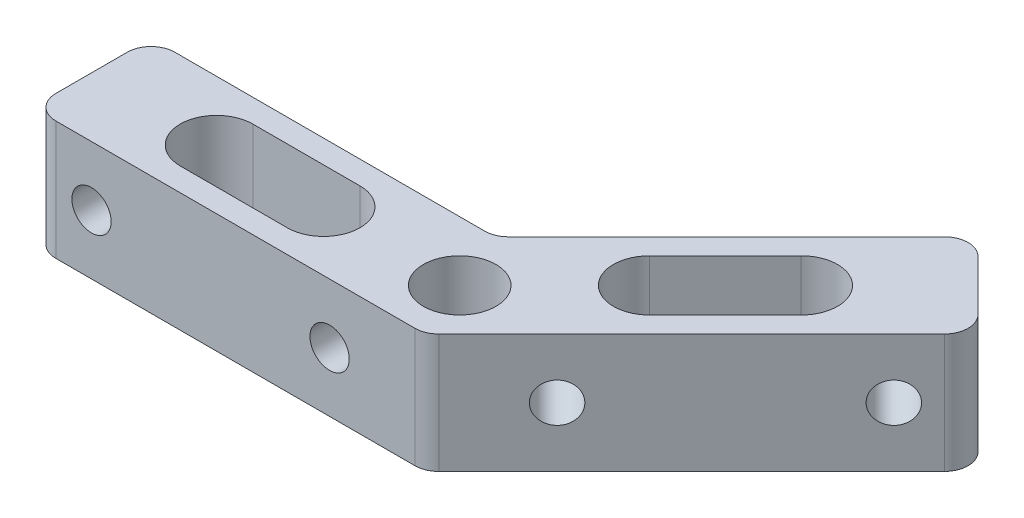
ISO-10303-21;
HEADER;
FILE_DESCRIPTION(('STEP AP214'),'2;1');
FILE_NAME('part.step','',(''),(''),'','','');
FILE_SCHEMA(('AUTOMOTIVE_DESIGN { 1 0 10303 214 1 1 1 1 }'));
ENDSEC;
DATA;
#1=APPLICATION_CONTEXT('core data for automotive mechanical design processes');
#2=APPLICATION_PROTOCOL_DEFINITION('international standard','automotive_design',2000,#1);
#3=PRODUCT_CONTEXT('',#1,'mechanical');
#4=PRODUCT('Part','Part','',(#3));
#5=PRODUCT_RELATED_PRODUCT_CATEGORY('part','',(#4));
#6=PRODUCT_DEFINITION_FORMATION('','',#4);
#7=PRODUCT_DEFINITION_CONTEXT('part definition',#1,'design');
#8=PRODUCT_DEFINITION('design','',#6,#7);
#9=PRODUCT_DEFINITION_SHAPE('','',#8);
#10=(LENGTH_UNIT() NAMED_UNIT(*) SI_UNIT(.MILLI.,.METRE.));
#11=(NAMED_UNIT(*) PLANE_ANGLE_UNIT() SI_UNIT($,.RADIAN.));
#12=(NAMED_UNIT(*) SI_UNIT($,.STERADIAN.) SOLID_ANGLE_UNIT());
#13=UNCERTAINTY_MEASURE_WITH_UNIT(LENGTH_MEASURE(1.E-05),#10,'distance_accuracy_value','');
#14=(GEOMETRIC_REPRESENTATION_CONTEXT(3) GLOBAL_UNCERTAINTY_ASSIGNED_CONTEXT((#13)) GLOBAL_UNIT_ASSIGNED_CONTEXT((#10,
#11,#12)) REPRESENTATION_CONTEXT('',''));
#15=CARTESIAN_POINT('',(0.,0.,0.));
#16=DIRECTION('',(0.,0.,1.));
#17=DIRECTION('',(1.,0.,0.));
#18=AXIS2_PLACEMENT_3D('',#15,#16,#17);
#19=CARTESIAN_POINT('',(-25.,10.,-5.));
#20=DIRECTION('',(1.,0.,0.));
#21=DIRECTION('',(0.,0.,-1.));
#22=AXIS2_PLACEMENT_3D('',#19,#20,#21);
#23=PLANE('',#22);
#24=DIRECTION('',(0.,0.,1.));
#25=VECTOR('',#24,1.);
#26=CARTESIAN_POINT('',(-25.,0.,-5.));
#27=LINE('',#26,#25);
#28=CARTESIAN_POINT('',(-25.,0.,-13.));
#29=VERTEX_POINT('',#28);
#30=CARTESIAN_POINT('',(-25.,0.,-7.));
#31=VERTEX_POINT('',#30);
#32=EDGE_CURVE('E285',#29,#31,#27,.T.);
#33=ORIENTED_EDGE('',*,*,#32,.T.);
#34=DIRECTION('',(0.,-1.,0.));
#35=VECTOR('',#34,1.);
#36=CARTESIAN_POINT('',(-25.,10.,-7.));
#37=LINE('',#36,#35);
#38=CARTESIAN_POINT('',(-25.,10.,-7.));
#39=VERTEX_POINT('',#38);
#40=EDGE_CURVE('E352',#31,#39,#37,.F.);
#41=ORIENTED_EDGE('',*,*,#40,.T.);
#42=DIRECTION('',(0.,0.,1.));
#43=VECTOR('',#42,1.);
#44=CARTESIAN_POINT('',(-25.,10.,-5.));
#45=LINE('',#44,#43);
#46=CARTESIAN_POINT('',(-25.,10.,-13.));
#47=VERTEX_POINT('',#46);
#48=EDGE_CURVE('E267',#47,#39,#45,.T.);
#49=ORIENTED_EDGE('',*,*,#48,.F.);
#50=DIRECTION('',(0.,-1.,0.));
#51=VECTOR('',#50,1.);
#52=CARTESIAN_POINT('',(-25.,10.,-13.));
#53=LINE('',#52,#51);
#54=EDGE_CURVE('E349',#47,#29,#53,.T.);
#55=ORIENTED_EDGE('',*,*,#54,.T.);
#56=EDGE_LOOP('',(#33,#41,#49,#55));
#57=FACE_BOUND('',#56,.T.);
#58=ADVANCED_FACE('F33',(#57),#23,.F.);
#59=CARTESIAN_POINT('',(-25.,10.,-5.));
#60=DIRECTION('',(0.,0.,-1.));
#61=DIRECTION('',(-1.,0.,0.));
#62=AXIS2_PLACEMENT_3D('',#59,#60,#61);
#63=PLANE('',#62);
#64=CARTESIAN_POINT('',(-20.,5.,-5.00000000000001));
#65=DIRECTION('',(0.,0.,1.));
#66=DIRECTION('',(1.,0.,0.));
#67=AXIS2_PLACEMENT_3D('',#64,#65,#66);
#68=CIRCLE('',#67,1.65);
#69=CARTESIAN_POINT('',(-18.35,5.,-5.00000000000001));
#70=VERTEX_POINT('',#69);
#71=EDGE_CURVE('E261',#70,#70,#68,.T.);
#72=ORIENTED_EDGE('',*,*,#71,.F.);
#73=EDGE_LOOP('',(#72));
#74=FACE_BOUND('',#73,.T.);
#75=CARTESIAN_POINT('',(0.,5.,-5.00000000000001));
#76=DIRECTION('',(0.,0.,1.));
#77=DIRECTION('',(1.,0.,0.));
#78=AXIS2_PLACEMENT_3D('',#75,#76,#77);
#79=CIRCLE('',#78,1.65);
#80=CARTESIAN_POINT('',(1.65,5.,-5.00000000000001));
#81=VERTEX_POINT('',#80);
#82=EDGE_CURVE('E256',#81,#81,#79,.T.);
#83=ORIENTED_EDGE('',*,*,#82,.F.);
#84=EDGE_LOOP('',(#83));
#85=FACE_BOUND('',#84,.T.);
#86=DIRECTION('',(1.,0.,0.));
#87=VECTOR('',#86,1.);
#88=CARTESIAN_POINT('',(-25.,0.,-5.));
#89=LINE('',#88,#87);
#90=CARTESIAN_POINT('',(-23.,0.,-5.));
#91=VERTEX_POINT('',#90);
#92=CARTESIAN_POINT('',(7.17157287525381,0.,-5.00000000000001));
#93=VERTEX_POINT('',#92);
#94=EDGE_CURVE('E288',#91,#93,#89,.T.);
#95=ORIENTED_EDGE('',*,*,#94,.T.);
#96=DIRECTION('',(0.,-1.,0.));
#97=VECTOR('',#96,1.);
#98=CARTESIAN_POINT('',(7.17157287525381,10.,-5.00000000000001));
#99=LINE('',#98,#97);
#100=CARTESIAN_POINT('',(7.17157287525381,10.,-5.00000000000001));
#101=VERTEX_POINT('',#100);
#102=EDGE_CURVE('E343',#93,#101,#99,.F.);
#103=ORIENTED_EDGE('',*,*,#102,.T.);
#104=DIRECTION('',(1.,0.,0.));
#105=VECTOR('',#104,1.);
#106=CARTESIAN_POINT('',(-25.,10.,-5.));
#107=LINE('',#106,#105);
#108=CARTESIAN_POINT('',(-23.,10.,-5.));
#109=VERTEX_POINT('',#108);
#110=EDGE_CURVE('E270',#109,#101,#107,.T.);
#111=ORIENTED_EDGE('',*,*,#110,.F.);
#112=DIRECTION('',(0.,-1.,0.));
#113=VECTOR('',#112,1.);
#114=CARTESIAN_POINT('',(-23.,10.,-5.));
#115=LINE('',#114,#113);
#116=EDGE_CURVE('E340',#109,#91,#115,.T.);
#117=ORIENTED_EDGE('',*,*,#116,.T.);
#118=EDGE_LOOP('',(#95,#103,#111,#117));
#119=FACE_BOUND('',#118,.T.);
#120=ADVANCED_FACE('F381',(#74,#85,#119),#63,.F.);
#121=CARTESIAN_POINT('',(31.2334957055045,10.,-28.2334957055045));
#122=DIRECTION('',(-0.707106781186548,0.,-0.707106781186548));
#123=DIRECTION('',(-0.707106781186548,0.,0.707106781186548));
#124=AXIS2_PLACEMENT_3D('',#121,#122,#123);
#125=PLANE('',#124);
#126=CARTESIAN_POINT('',(27.6979617995717,5.,-24.6979617995718));
#127=DIRECTION('',(0.707106781186548,0.,0.707106781186547));
#128=DIRECTION('',(0.707106781186547,0.,-0.707106781186548));
#129=AXIS2_PLACEMENT_3D('',#126,#127,#128);
#130=CIRCLE('',#129,1.65);
#131=CARTESIAN_POINT('',(28.8646879885295,5.,-25.8646879885296));
#132=VERTEX_POINT('',#131);
#133=EDGE_CURVE('E249',#132,#132,#130,.T.);
#134=ORIENTED_EDGE('',*,*,#133,.F.);
#135=EDGE_LOOP('',(#134));
#136=FACE_BOUND('',#135,.T.);
#137=CARTESIAN_POINT('',(13.5558261758408,5.,-10.5558261758408));
#138=DIRECTION('',(0.707106781186548,0.,0.707106781186547));
#139=DIRECTION('',(0.707106781186547,0.,-0.707106781186548));
#140=AXIS2_PLACEMENT_3D('',#137,#138,#139);
#141=CIRCLE('',#140,1.65);
#142=CARTESIAN_POINT('',(14.7225523647986,5.,-11.7225523647986));
#143=VERTEX_POINT('',#142);
#144=EDGE_CURVE('E210',#143,#143,#141,.T.);
#145=ORIENTED_EDGE('',*,*,#144,.F.);
#146=EDGE_LOOP('',(#145));
#147=FACE_BOUND('',#146,.T.);
#148=DIRECTION('',(0.707106781186547,0.,-0.707106781186547));
#149=VECTOR('',#148,1.);
#150=CARTESIAN_POINT('',(31.2334957055045,0.,-28.2334957055045));
#151=LINE('',#150,#149);
#152=CARTESIAN_POINT('',(8.58578643762691,0.,-5.58578643762692));
#153=VERTEX_POINT('',#152);
#154=CARTESIAN_POINT('',(29.8192821431314,0.,-26.8192821431314));
#155=VERTEX_POINT('',#154);
#156=EDGE_CURVE('E292',#153,#155,#151,.T.);
#157=ORIENTED_EDGE('',*,*,#156,.T.);
#158=DIRECTION('',(0.,-1.,0.));
#159=VECTOR('',#158,1.);
#160=CARTESIAN_POINT('',(29.8192821431314,10.,-26.8192821431314));
#161=LINE('',#160,#159);
#162=CARTESIAN_POINT('',(29.8192821431314,10.,-26.8192821431314));
#163=VERTEX_POINT('',#162);
#164=EDGE_CURVE('E323',#155,#163,#161,.F.);
#165=ORIENTED_EDGE('',*,*,#164,.T.);
#166=DIRECTION('',(0.707106781186547,0.,-0.707106781186547));
#167=VECTOR('',#166,1.);
#168=CARTESIAN_POINT('',(31.2334957055045,10.,-28.2334957055045));
#169=LINE('',#168,#167);
#170=CARTESIAN_POINT('',(8.58578643762691,10.,-5.58578643762692));
#171=VERTEX_POINT('',#170);
#172=EDGE_CURVE('E274',#171,#163,#169,.T.);
#173=ORIENTED_EDGE('',*,*,#172,.F.);
#174=DIRECTION('',(0.,-1.,0.));
#175=VECTOR('',#174,1.);
#176=CARTESIAN_POINT('',(8.5857864376269,10.,-5.58578643762692));
#177=LINE('',#176,#175);
#178=EDGE_CURVE('E320',#171,#153,#177,.T.);
#179=ORIENTED_EDGE('',*,*,#178,.T.);
#180=EDGE_LOOP('',(#157,#165,#173,#179));
#181=FACE_BOUND('',#180,.T.);
#182=ADVANCED_FACE('F390',(#136,#147,#181),#125,.F.);
#183=CARTESIAN_POINT('',(24.162427893639,10.,-35.3045635173699));
#184=DIRECTION('',(-0.707106781186547,0.,0.707106781186548));
#185=DIRECTION('',(0.707106781186548,0.,0.707106781186547));
#186=AXIS2_PLACEMENT_3D('',#183,#184,#185);
#187=PLANE('',#186);
#188=DIRECTION('',(-0.707106781186548,0.,-0.707106781186547));
#189=VECTOR('',#188,1.);
#190=CARTESIAN_POINT('',(24.162427893639,10.,-35.3045635173699));
#191=LINE('',#190,#189);
#192=CARTESIAN_POINT('',(29.8192821431314,10.,-29.6477092678776));
#193=VERTEX_POINT('',#192);
#194=CARTESIAN_POINT('',(25.5766414560121,10.,-33.8903499549969));
#195=VERTEX_POINT('',#194);
#196=EDGE_CURVE('E277',#193,#195,#191,.T.);
#197=ORIENTED_EDGE('',*,*,#196,.F.);
#198=DIRECTION('',(0.,-1.,0.));
#199=VECTOR('',#198,1.);
#200=CARTESIAN_POINT('',(29.8192821431314,10.,-29.6477092678776));
#201=LINE('',#200,#199);
#202=CARTESIAN_POINT('',(29.8192821431314,0.,-29.6477092678776));
#203=VERTEX_POINT('',#202);
#204=EDGE_CURVE('E307',#193,#203,#201,.T.);
#205=ORIENTED_EDGE('',*,*,#204,.T.);
#206=DIRECTION('',(-0.707106781186548,0.,-0.707106781186547));
#207=VECTOR('',#206,1.);
#208=CARTESIAN_POINT('',(24.162427893639,0.,-35.3045635173699));
#209=LINE('',#208,#207);
#210=CARTESIAN_POINT('',(25.5766414560121,0.,-33.8903499549969));
#211=VERTEX_POINT('',#210);
#212=EDGE_CURVE('E295',#203,#211,#209,.T.);
#213=ORIENTED_EDGE('',*,*,#212,.T.);
#214=DIRECTION('',(0.,-1.,0.));
#215=VECTOR('',#214,1.);
#216=CARTESIAN_POINT('',(25.5766414560121,10.,-33.8903499549969));
#217=LINE('',#216,#215);
#218=EDGE_CURVE('E284',#211,#195,#217,.F.);
#219=ORIENTED_EDGE('',*,*,#218,.T.);
#220=EDGE_LOOP('',(#197,#205,#213,#219));
#221=FACE_BOUND('',#220,.T.);
#222=ADVANCED_FACE('F398',(#221),#187,.F.);
#223=CARTESIAN_POINT('',(3.85786437626904,10.,-15.));
#224=DIRECTION('',(0.707106781186547,0.,0.707106781186548));
#225=DIRECTION('',(0.707106781186548,0.,-0.707106781186547));
#226=AXIS2_PLACEMENT_3D('',#223,#224,#225);
#227=PLANE('',#226);
#228=CARTESIAN_POINT('',(20.6268939877063,5.,-31.7690296114372));
#229=DIRECTION('',(0.707106781186547,0.,0.707106781186548));
#230=DIRECTION('',(0.707106781186548,0.,-0.707106781186547));
#231=AXIS2_PLACEMENT_3D('',#228,#229,#230);
#232=CIRCLE('',#231,1.65);
#233=CARTESIAN_POINT('',(21.7936201766641,5.,-32.935755800395));
#234=VERTEX_POINT('',#233);
#235=EDGE_CURVE('E252',#234,#234,#232,.F.);
#236=ORIENTED_EDGE('',*,*,#235,.F.);
#237=EDGE_LOOP('',(#236));
#238=FACE_BOUND('',#237,.T.);
#239=CARTESIAN_POINT('',(6.48475836397529,5.,-17.6268939877063));
#240=DIRECTION('',(0.707106781186547,0.,0.707106781186548));
#241=DIRECTION('',(0.707106781186548,0.,-0.707106781186547));
#242=AXIS2_PLACEMENT_3D('',#239,#240,#241);
#243=CIRCLE('',#242,1.65);
#244=CARTESIAN_POINT('',(7.65148455293309,5.,-18.7936201766641));
#245=VERTEX_POINT('',#244);
#246=EDGE_CURVE('E253',#245,#245,#243,.F.);
#247=ORIENTED_EDGE('',*,*,#246,.F.);
#248=EDGE_LOOP('',(#247));
#249=FACE_BOUND('',#248,.T.);
#250=DIRECTION('',(-0.707106781186548,0.,0.707106781186547));
#251=VECTOR('',#250,1.);
#252=CARTESIAN_POINT('',(3.85786437626904,10.,-15.));
#253=LINE('',#252,#251);
#254=CARTESIAN_POINT('',(22.7482143312659,10.,-33.8903499549968));
#255=VERTEX_POINT('',#254);
#256=CARTESIAN_POINT('',(4.44365081389595,10.,-15.5857864376269));
#257=VERTEX_POINT('',#256);
#258=EDGE_CURVE('E280',#255,#257,#253,.T.);
#259=ORIENTED_EDGE('',*,*,#258,.F.);
#260=DIRECTION('',(0.,-1.,0.));
#261=VECTOR('',#260,1.);
#262=CARTESIAN_POINT('',(22.7482143312659,10.,-33.8903499549968));
#263=LINE('',#262,#261);
#264=CARTESIAN_POINT('',(22.7482143312659,0.,-33.8903499549968));
#265=VERTEX_POINT('',#264);
#266=EDGE_CURVE('E337',#255,#265,#263,.T.);
#267=ORIENTED_EDGE('',*,*,#266,.T.);
#268=DIRECTION('',(-0.707106781186548,0.,0.707106781186547));
#269=VECTOR('',#268,1.);
#270=CARTESIAN_POINT('',(3.85786437626904,0.,-15.));
#271=LINE('',#270,#269);
#272=CARTESIAN_POINT('',(4.44365081389595,0.,-15.5857864376269));
#273=VERTEX_POINT('',#272);
#274=EDGE_CURVE('E298',#265,#273,#271,.T.);
#275=ORIENTED_EDGE('',*,*,#274,.T.);
#276=DIRECTION('',(0.,-1.,0.));
#277=VECTOR('',#276,1.);
#278=CARTESIAN_POINT('',(4.44365081389595,10.,-15.5857864376269));
#279=LINE('',#278,#277);
#280=EDGE_CURVE('E335',#273,#257,#279,.F.);
#281=ORIENTED_EDGE('',*,*,#280,.T.);
#282=EDGE_LOOP('',(#259,#267,#275,#281));
#283=FACE_BOUND('',#282,.T.);
#284=ADVANCED_FACE('F362',(#238,#249,#283),#227,.F.);
#285=CARTESIAN_POINT('',(-25.,10.,-15.));
#286=DIRECTION('',(0.,0.,1.));
#287=DIRECTION('',(1.,0.,0.));
#288=AXIS2_PLACEMENT_3D('',#285,#286,#287);
#289=PLANE('',#288);
#290=CARTESIAN_POINT('',(-20.,5.,-15.));
#291=DIRECTION('',(0.,0.,1.));
#292=DIRECTION('',(1.,0.,0.));
#293=AXIS2_PLACEMENT_3D('',#290,#291,#292);
#294=CIRCLE('',#293,1.65);
#295=CARTESIAN_POINT('',(-18.35,5.,-15.));
#296=VERTEX_POINT('',#295);
#297=EDGE_CURVE('E289',#296,#296,#294,.T.);
#298=ORIENTED_EDGE('',*,*,#297,.T.);
#299=EDGE_LOOP('',(#298));
#300=FACE_BOUND('',#299,.T.);
#301=CARTESIAN_POINT('',(0.,5.,-15.));
#302=DIRECTION('',(0.,0.,1.));
#303=DIRECTION('',(1.,0.,0.));
#304=AXIS2_PLACEMENT_3D('',#301,#302,#303);
#305=CIRCLE('',#304,1.65);
#306=CARTESIAN_POINT('',(1.65,5.,-15.));
#307=VERTEX_POINT('',#306);
#308=EDGE_CURVE('E264',#307,#307,#305,.T.);
#309=ORIENTED_EDGE('',*,*,#308,.T.);
#310=EDGE_LOOP('',(#309));
#311=FACE_BOUND('',#310,.T.);
#312=DIRECTION('',(-1.,0.,0.));
#313=VECTOR('',#312,1.);
#314=CARTESIAN_POINT('',(-25.,10.,-15.));
#315=LINE('',#314,#313);
#316=CARTESIAN_POINT('',(3.02943725152286,10.,-15.));
#317=VERTEX_POINT('',#316);
#318=CARTESIAN_POINT('',(-23.,10.,-15.));
#319=VERTEX_POINT('',#318);
#320=EDGE_CURVE('E282',#317,#319,#315,.T.);
#321=ORIENTED_EDGE('',*,*,#320,.F.);
#322=DIRECTION('',(0.,-1.,0.));
#323=VECTOR('',#322,1.);
#324=CARTESIAN_POINT('',(3.02943725152286,0.,-15.));
#325=LINE('',#324,#323);
#326=CARTESIAN_POINT('',(3.02943725152286,0.,-15.));
#327=VERTEX_POINT('',#326);
#328=EDGE_CURVE('E346',#317,#327,#325,.T.);
#329=ORIENTED_EDGE('',*,*,#328,.T.);
#330=DIRECTION('',(-1.,0.,0.));
#331=VECTOR('',#330,1.);
#332=CARTESIAN_POINT('',(-25.,0.,-15.));
#333=LINE('',#332,#331);
#334=CARTESIAN_POINT('',(-23.,0.,-15.));
#335=VERTEX_POINT('',#334);
#336=EDGE_CURVE('E271',#327,#335,#333,.T.);
#337=ORIENTED_EDGE('',*,*,#336,.T.);
#338=DIRECTION('',(0.,-1.,0.));
#339=VECTOR('',#338,1.);
#340=CARTESIAN_POINT('',(-23.,10.,-15.));
#341=LINE('',#340,#339);
#342=EDGE_CURVE('E48',#335,#319,#341,.F.);
#343=ORIENTED_EDGE('',*,*,#342,.T.);
#344=EDGE_LOOP('',(#321,#329,#337,#343));
#345=FACE_BOUND('',#344,.T.);
#346=ADVANCED_FACE('F365',(#300,#311,#345),#289,.F.);
#347=CARTESIAN_POINT('',(0.,10.,0.));
#348=DIRECTION('',(0.,-1.,0.));
#349=DIRECTION('',(0.,0.,-1.));
#350=AXIS2_PLACEMENT_3D('',#347,#348,#349);
#351=PLANE('',#350);
#352=CARTESIAN_POINT('',(-5.5,10.,-10.));
#353=DIRECTION('',(0.,1.,0.));
#354=DIRECTION('',(0.,0.,1.));
#355=AXIS2_PLACEMENT_3D('',#352,#353,#354);
#356=CIRCLE('',#355,3.05);
#357=CARTESIAN_POINT('',(-5.5,10.,-6.95000000000001));
#358=VERTEX_POINT('',#357);
#359=CARTESIAN_POINT('',(-5.5,10.,-13.05));
#360=VERTEX_POINT('',#359);
#361=EDGE_CURVE('E195',#358,#360,#356,.T.);
#362=ORIENTED_EDGE('',*,*,#361,.F.);
#363=DIRECTION('',(1.,0.,0.));
#364=VECTOR('',#363,1.);
#365=CARTESIAN_POINT('',(-14.5,10.,-6.95000000000001));
#366=LINE('',#365,#364);
#367=CARTESIAN_POINT('',(-14.5,10.,-6.95000000000001));
#368=VERTEX_POINT('',#367);
#369=EDGE_CURVE('E187',#368,#358,#366,.T.);
#370=ORIENTED_EDGE('',*,*,#369,.F.);
#371=CARTESIAN_POINT('',(-14.5,10.,-10.));
#372=DIRECTION('',(0.,1.,0.));
#373=DIRECTION('',(0.,0.,1.));
#374=AXIS2_PLACEMENT_3D('',#371,#372,#373);
#375=CIRCLE('',#374,3.05);
#376=CARTESIAN_POINT('',(-14.5,10.,-13.05));
#377=VERTEX_POINT('',#376);
#378=EDGE_CURVE('E199',#377,#368,#375,.T.);
#379=ORIENTED_EDGE('',*,*,#378,.F.);
#380=DIRECTION('',(-1.,0.,0.));
#381=VECTOR('',#380,1.);
#382=CARTESIAN_POINT('',(-14.5,10.,-13.05));
#383=LINE('',#382,#381);
#384=EDGE_CURVE('E193',#360,#377,#383,.T.);
#385=ORIENTED_EDGE('',*,*,#384,.F.);
#386=EDGE_LOOP('',(#362,#370,#379,#385));
#387=FACE_BOUND('',#386,.T.);
#388=CARTESIAN_POINT('',(13.909379566434,10.,-17.9804473782995));
#389=DIRECTION('',(0.,1.,0.));
#390=DIRECTION('',(0.,0.,1.));
#391=AXIS2_PLACEMENT_3D('',#388,#389,#390);
#392=CIRCLE('',#391,3.04999999999999);
#393=CARTESIAN_POINT('',(11.7527038838151,10.,-20.1371230609185));
#394=VERTEX_POINT('',#393);
#395=CARTESIAN_POINT('',(16.066055249053,10.,-15.8237716956806));
#396=VERTEX_POINT('',#395);
#397=EDGE_CURVE('E214',#394,#396,#392,.T.);
#398=ORIENTED_EDGE('',*,*,#397,.F.);
#399=DIRECTION('',(-0.707106781186547,0.,0.707106781186548));
#400=VECTOR('',#399,1.);
#401=CARTESIAN_POINT('',(18.116664914494,10.,-26.5010840915974));
#402=LINE('',#401,#400);
#403=CARTESIAN_POINT('',(18.116664914494,10.,-26.5010840915974));
#404=VERTEX_POINT('',#403);
#405=EDGE_CURVE('E217',#404,#394,#402,.T.);
#406=ORIENTED_EDGE('',*,*,#405,.F.);
#407=CARTESIAN_POINT('',(20.273340597113,10.,-24.3444084089785));
#408=DIRECTION('',(0.,1.,0.));
#409=DIRECTION('',(0.,0.,1.));
#410=AXIS2_PLACEMENT_3D('',#407,#408,#409);
#411=CIRCLE('',#410,3.04999999999999);
#412=CARTESIAN_POINT('',(22.4300162797319,10.,-22.1877327263595));
#413=VERTEX_POINT('',#412);
#414=EDGE_CURVE('E220',#413,#404,#411,.T.);
#415=ORIENTED_EDGE('',*,*,#414,.F.);
#416=DIRECTION('',(0.707106781186547,0.,-0.707106781186548));
#417=VECTOR('',#416,1.);
#418=CARTESIAN_POINT('',(22.4300162797319,10.,-22.1877327263595));
#419=LINE('',#418,#417);
#420=EDGE_CURVE('E211',#396,#413,#419,.T.);
#421=ORIENTED_EDGE('',*,*,#420,.F.);
#422=EDGE_LOOP('',(#398,#406,#415,#421));
#423=FACE_BOUND('',#422,.T.);
#424=CARTESIAN_POINT('',(5.92893218813452,10.,-10.));
#425=DIRECTION('',(0.,1.,0.));
#426=DIRECTION('',(0.,0.,1.));
#427=AXIS2_PLACEMENT_3D('',#424,#425,#426);
#428=CIRCLE('',#427,3.05);
#429=CARTESIAN_POINT('',(5.92893218813452,10.,-6.95));
#430=VERTEX_POINT('',#429);
#431=EDGE_CURVE('E244',#430,#430,#428,.T.);
#432=ORIENTED_EDGE('',*,*,#431,.F.);
#433=EDGE_LOOP('',(#432));
#434=FACE_BOUND('',#433,.T.);
#435=ORIENTED_EDGE('',*,*,#172,.T.);
#436=CARTESIAN_POINT('',(28.4050685807583,10.,-28.2334957055045));
#437=DIRECTION('',(0.,-1.,0.));
#438=DIRECTION('',(0.,0.,-1.));
#439=AXIS2_PLACEMENT_3D('',#436,#437,#438);
#440=CIRCLE('',#439,2.);
#441=EDGE_CURVE('E333',#163,#193,#440,.F.);
#442=ORIENTED_EDGE('',*,*,#441,.T.);
#443=ORIENTED_EDGE('',*,*,#196,.T.);
#444=CARTESIAN_POINT('',(24.162427893639,10.,-32.4761363926238));
#445=DIRECTION('',(0.,-1.,0.));
#446=DIRECTION('',(0.,0.,-1.));
#447=AXIS2_PLACEMENT_3D('',#444,#445,#446);
#448=CIRCLE('',#447,2.);
#449=EDGE_CURVE('E331',#195,#255,#448,.F.);
#450=ORIENTED_EDGE('',*,*,#449,.T.);
#451=ORIENTED_EDGE('',*,*,#258,.T.);
#452=CARTESIAN_POINT('',(3.02943725152286,10.,-17.));
#453=DIRECTION('',(0.,-1.,0.));
#454=DIRECTION('',(0.,0.,-1.));
#455=AXIS2_PLACEMENT_3D('',#452,#453,#454);
#456=CIRCLE('',#455,2.);
#457=EDGE_CURVE('E11',#257,#317,#456,.T.);
#458=ORIENTED_EDGE('',*,*,#457,.T.);
#459=ORIENTED_EDGE('',*,*,#320,.T.);
#460=CARTESIAN_POINT('',(-23.,10.,-13.));
#461=DIRECTION('',(0.,-1.,0.));
#462=DIRECTION('',(0.,0.,-1.));
#463=AXIS2_PLACEMENT_3D('',#460,#461,#462);
#464=CIRCLE('',#463,2.);
#465=EDGE_CURVE('E325',#319,#47,#464,.F.);
#466=ORIENTED_EDGE('',*,*,#465,.T.);
#467=ORIENTED_EDGE('',*,*,#48,.T.);
#468=CARTESIAN_POINT('',(-23.,10.,-7.));
#469=DIRECTION('',(0.,-1.,0.));
#470=DIRECTION('',(0.,0.,-1.));
#471=AXIS2_PLACEMENT_3D('',#468,#469,#470);
#472=CIRCLE('',#471,2.);
#473=EDGE_CURVE('E327',#39,#109,#472,.F.);
#474=ORIENTED_EDGE('',*,*,#473,.T.);
#475=ORIENTED_EDGE('',*,*,#110,.T.);
#476=CARTESIAN_POINT('',(7.17157287525381,10.,-7.00000000000001));
#477=DIRECTION('',(0.,-1.,0.));
#478=DIRECTION('',(0.,0.,-1.));
#479=AXIS2_PLACEMENT_3D('',#476,#477,#478);
#480=CIRCLE('',#479,2.);
#481=EDGE_CURVE('E329',#101,#171,#480,.F.);
#482=ORIENTED_EDGE('',*,*,#481,.T.);
#483=EDGE_LOOP('',(#435,#442,#443,#450,#451,#458,#459,#466,#467,#474,#475,#482));
#484=FACE_BOUND('',#483,.T.);
#485=ADVANCED_FACE('F367',(#387,#423,#434,#484),#351,.F.);
#486=CARTESIAN_POINT('',(0.,0.,0.));
#487=DIRECTION('',(0.,-1.,0.));
#488=DIRECTION('',(0.,0.,-1.));
#489=AXIS2_PLACEMENT_3D('',#486,#487,#488);
#490=PLANE('',#489);
#491=DIRECTION('',(1.,0.,0.));
#492=VECTOR('',#491,1.);
#493=CARTESIAN_POINT('',(-14.5,0.,-6.95000000000001));
#494=LINE('',#493,#492);
#495=CARTESIAN_POINT('',(-14.5,0.,-6.95000000000001));
#496=VERTEX_POINT('',#495);
#497=CARTESIAN_POINT('',(-5.5,0.,-6.95000000000001));
#498=VERTEX_POINT('',#497);
#499=EDGE_CURVE('E184',#496,#498,#494,.T.);
#500=ORIENTED_EDGE('',*,*,#499,.T.);
#501=CARTESIAN_POINT('',(-5.5,0.,-10.));
#502=DIRECTION('',(0.,-1.,0.));
#503=DIRECTION('',(0.,0.,-1.));
#504=AXIS2_PLACEMENT_3D('',#501,#502,#503);
#505=CIRCLE('',#504,3.05);
#506=CARTESIAN_POINT('',(-5.5,0.,-13.05));
#507=VERTEX_POINT('',#506);
#508=EDGE_CURVE('E170',#498,#507,#505,.F.);
#509=ORIENTED_EDGE('',*,*,#508,.T.);
#510=DIRECTION('',(-1.,0.,0.));
#511=VECTOR('',#510,1.);
#512=CARTESIAN_POINT('',(-14.5,0.,-13.05));
#513=LINE('',#512,#511);
#514=CARTESIAN_POINT('',(-14.5,0.,-13.05));
#515=VERTEX_POINT('',#514);
#516=EDGE_CURVE('E204',#507,#515,#513,.T.);
#517=ORIENTED_EDGE('',*,*,#516,.T.);
#518=CARTESIAN_POINT('',(-14.5,0.,-10.));
#519=DIRECTION('',(0.,-1.,0.));
#520=DIRECTION('',(0.,0.,-1.));
#521=AXIS2_PLACEMENT_3D('',#518,#519,#520);
#522=CIRCLE('',#521,3.05);
#523=EDGE_CURVE('E192',#515,#496,#522,.F.);
#524=ORIENTED_EDGE('',*,*,#523,.T.);
#525=EDGE_LOOP('',(#500,#509,#517,#524));
#526=FACE_BOUND('',#525,.T.);
#527=DIRECTION('',(-0.707106781186547,0.,0.707106781186548));
#528=VECTOR('',#527,1.);
#529=CARTESIAN_POINT('',(18.116664914494,0.,-26.5010840915974));
#530=LINE('',#529,#528);
#531=CARTESIAN_POINT('',(18.116664914494,0.,-26.5010840915974));
#532=VERTEX_POINT('',#531);
#533=CARTESIAN_POINT('',(11.7527038838151,0.,-20.1371230609185));
#534=VERTEX_POINT('',#533);
#535=EDGE_CURVE('E213',#532,#534,#530,.T.);
#536=ORIENTED_EDGE('',*,*,#535,.T.);
#537=CARTESIAN_POINT('',(13.909379566434,0.,-17.9804473782995));
#538=DIRECTION('',(0.,-1.,0.));
#539=DIRECTION('',(0.,0.,-1.));
#540=AXIS2_PLACEMENT_3D('',#537,#538,#539);
#541=CIRCLE('',#540,3.04999999999999);
#542=CARTESIAN_POINT('',(16.066055249053,0.,-15.8237716956806));
#543=VERTEX_POINT('',#542);
#544=EDGE_CURVE('E236',#534,#543,#541,.F.);
#545=ORIENTED_EDGE('',*,*,#544,.T.);
#546=DIRECTION('',(0.707106781186547,0.,-0.707106781186548));
#547=VECTOR('',#546,1.);
#548=CARTESIAN_POINT('',(22.4300162797319,0.,-22.1877327263595));
#549=LINE('',#548,#547);
#550=CARTESIAN_POINT('',(22.4300162797319,0.,-22.1877327263595));
#551=VERTEX_POINT('',#550);
#552=EDGE_CURVE('E232',#543,#551,#549,.T.);
#553=ORIENTED_EDGE('',*,*,#552,.T.);
#554=CARTESIAN_POINT('',(20.273340597113,0.,-24.3444084089785));
#555=DIRECTION('',(0.,-1.,0.));
#556=DIRECTION('',(0.,0.,-1.));
#557=AXIS2_PLACEMENT_3D('',#554,#555,#556);
#558=CIRCLE('',#557,3.04999999999999);
#559=EDGE_CURVE('E227',#551,#532,#558,.F.);
#560=ORIENTED_EDGE('',*,*,#559,.T.);
#561=EDGE_LOOP('',(#536,#545,#553,#560));
#562=FACE_BOUND('',#561,.T.);
#563=CARTESIAN_POINT('',(5.92893218813452,0.,-10.));
#564=DIRECTION('',(0.,-1.,0.));
#565=DIRECTION('',(0.,0.,-1.));
#566=AXIS2_PLACEMENT_3D('',#563,#564,#565);
#567=CIRCLE('',#566,3.05);
#568=CARTESIAN_POINT('',(5.92893218813452,0.,-13.05));
#569=VERTEX_POINT('',#568);
#570=EDGE_CURVE('E223',#569,#569,#567,.F.);
#571=ORIENTED_EDGE('',*,*,#570,.T.);
#572=EDGE_LOOP('',(#571));
#573=FACE_BOUND('',#572,.T.);
#574=ORIENTED_EDGE('',*,*,#212,.F.);
#575=CARTESIAN_POINT('',(28.4050685807583,0.,-28.2334957055045));
#576=DIRECTION('',(0.,-1.,0.));
#577=DIRECTION('',(0.,0.,-1.));
#578=AXIS2_PLACEMENT_3D('',#575,#576,#577);
#579=CIRCLE('',#578,2.);
#580=EDGE_CURVE('E318',#203,#155,#579,.T.);
#581=ORIENTED_EDGE('',*,*,#580,.T.);
#582=ORIENTED_EDGE('',*,*,#156,.F.);
#583=CARTESIAN_POINT('',(7.17157287525381,0.,-7.00000000000001));
#584=DIRECTION('',(0.,-1.,0.));
#585=DIRECTION('',(0.,0.,-1.));
#586=AXIS2_PLACEMENT_3D('',#583,#584,#585);
#587=CIRCLE('',#586,2.);
#588=EDGE_CURVE('E314',#153,#93,#587,.T.);
#589=ORIENTED_EDGE('',*,*,#588,.T.);
#590=ORIENTED_EDGE('',*,*,#94,.F.);
#591=CARTESIAN_POINT('',(-23.,0.,-7.));
#592=DIRECTION('',(0.,-1.,0.));
#593=DIRECTION('',(0.,0.,-1.));
#594=AXIS2_PLACEMENT_3D('',#591,#592,#593);
#595=CIRCLE('',#594,2.);
#596=EDGE_CURVE('E312',#91,#31,#595,.T.);
#597=ORIENTED_EDGE('',*,*,#596,.T.);
#598=ORIENTED_EDGE('',*,*,#32,.F.);
#599=CARTESIAN_POINT('',(-23.,0.,-13.));
#600=DIRECTION('',(0.,-1.,0.));
#601=DIRECTION('',(0.,0.,-1.));
#602=AXIS2_PLACEMENT_3D('',#599,#600,#601);
#603=CIRCLE('',#602,2.);
#604=EDGE_CURVE('E310',#29,#335,#603,.T.);
#605=ORIENTED_EDGE('',*,*,#604,.T.);
#606=ORIENTED_EDGE('',*,*,#336,.F.);
#607=CARTESIAN_POINT('',(3.02943725152286,0.,-17.));
#608=DIRECTION('',(0.,-1.,0.));
#609=DIRECTION('',(0.,0.,-1.));
#610=AXIS2_PLACEMENT_3D('',#607,#608,#609);
#611=CIRCLE('',#610,2.);
#612=EDGE_CURVE('E41',#327,#273,#611,.F.);
#613=ORIENTED_EDGE('',*,*,#612,.T.);
#614=ORIENTED_EDGE('',*,*,#274,.F.);
#615=CARTESIAN_POINT('',(24.162427893639,0.,-32.4761363926238));
#616=DIRECTION('',(0.,-1.,0.));
#617=DIRECTION('',(0.,0.,-1.));
#618=AXIS2_PLACEMENT_3D('',#615,#616,#617);
#619=CIRCLE('',#618,2.);
#620=EDGE_CURVE('E316',#265,#211,#619,.T.);
#621=ORIENTED_EDGE('',*,*,#620,.T.);
#622=EDGE_LOOP('',(#574,#581,#582,#589,#590,#597,#598,#605,#606,#613,#614,#621));
#623=FACE_BOUND('',#622,.T.);
#624=ADVANCED_FACE('F190',(#526,#562,#573,#623),#490,.T.);
#625=CARTESIAN_POINT('',(0.,5.,-35.3045635173699));
#626=DIRECTION('',(0.,0.,1.));
#627=DIRECTION('',(1.,0.,0.));
#628=AXIS2_PLACEMENT_3D('',#625,#626,#627);
#629=CYLINDRICAL_SURFACE('',#628,1.65);
#630=CARTESIAN_POINT('',(1.65,5.,-5.00000000000001));
#631=CARTESIAN_POINT('',(1.65,5.,-5.10416666666667));
#632=CARTESIAN_POINT('',(1.65,5.,-5.20833333333334));
#633=CARTESIAN_POINT('',(1.65,5.,-5.41666666666667));
#634=CARTESIAN_POINT('',(1.65,5.,-5.52083333333334));
#635=CARTESIAN_POINT('',(1.65,5.,-5.72916666666667));
#636=CARTESIAN_POINT('',(1.65,5.,-5.83333333333334));
#637=CARTESIAN_POINT('',(1.65,5.,-6.04166666666667));
#638=CARTESIAN_POINT('',(1.65,5.,-6.14583333333334));
#639=CARTESIAN_POINT('',(1.65,5.,-6.35416666666668));
#640=CARTESIAN_POINT('',(1.65,5.,-6.45833333333334));
#641=CARTESIAN_POINT('',(1.65,5.,-6.66666666666668));
#642=CARTESIAN_POINT('',(1.65,5.,-6.77083333333334));
#643=CARTESIAN_POINT('',(1.65,5.,-6.97916666666668));
#644=CARTESIAN_POINT('',(1.65,5.,-7.08333333333334));
#645=CARTESIAN_POINT('',(1.65,5.,-7.29166666666668));
#646=CARTESIAN_POINT('',(1.65,5.,-7.39583333333334));
#647=CARTESIAN_POINT('',(1.65,5.,-7.60416666666668));
#648=CARTESIAN_POINT('',(1.65,5.,-7.70833333333334));
#649=CARTESIAN_POINT('',(1.65,5.,-7.91666666666668));
#650=CARTESIAN_POINT('',(1.65,5.,-8.02083333333334));
#651=CARTESIAN_POINT('',(1.65,5.,-8.22916666666668));
#652=CARTESIAN_POINT('',(1.65,5.,-8.33333333333334));
#653=CARTESIAN_POINT('',(1.65,5.,-8.54166666666668));
#654=CARTESIAN_POINT('',(1.65,5.,-8.64583333333334));
#655=CARTESIAN_POINT('',(1.65,5.,-8.85416666666668));
#656=CARTESIAN_POINT('',(1.65,5.,-8.95833333333334));
#657=CARTESIAN_POINT('',(1.65,5.,-9.16666666666668));
#658=CARTESIAN_POINT('',(1.65,5.,-9.27083333333334));
#659=CARTESIAN_POINT('',(1.65,5.,-9.47916666666668));
#660=CARTESIAN_POINT('',(1.65,5.,-9.58333333333334));
#661=CARTESIAN_POINT('',(1.65,5.,-9.79166666666668));
#662=CARTESIAN_POINT('',(1.65,5.,-9.89583333333334));
#663=CARTESIAN_POINT('',(1.65,5.,-10.1041666666667));
#664=CARTESIAN_POINT('',(1.65,5.,-10.2083333333333));
#665=CARTESIAN_POINT('',(1.65,5.,-10.4166666666667));
#666=CARTESIAN_POINT('',(1.65,5.,-10.5208333333333));
#667=CARTESIAN_POINT('',(1.65,5.,-10.7291666666667));
#668=CARTESIAN_POINT('',(1.65,5.,-10.8333333333333));
#669=CARTESIAN_POINT('',(1.65,5.,-11.0416666666667));
#670=CARTESIAN_POINT('',(1.65,5.,-11.1458333333333));
#671=CARTESIAN_POINT('',(1.65,5.,-11.3541666666667));
#672=CARTESIAN_POINT('',(1.65,5.,-11.4583333333333));
#673=CARTESIAN_POINT('',(1.65,5.,-11.6666666666667));
#674=CARTESIAN_POINT('',(1.65,5.,-11.7708333333333));
#675=CARTESIAN_POINT('',(1.65,5.,-11.9791666666667));
#676=CARTESIAN_POINT('',(1.65,5.,-12.0833333333333));
#677=CARTESIAN_POINT('',(1.65,5.,-12.2916666666667));
#678=CARTESIAN_POINT('',(1.65,5.,-12.3958333333333));
#679=CARTESIAN_POINT('',(1.65,5.,-12.6041666666667));
#680=CARTESIAN_POINT('',(1.65,5.,-12.7083333333333));
#681=CARTESIAN_POINT('',(1.65,5.,-12.9166666666667));
#682=CARTESIAN_POINT('',(1.65,5.,-13.0208333333333));
#683=CARTESIAN_POINT('',(1.65,5.,-13.2291666666667));
#684=CARTESIAN_POINT('',(1.65,5.,-13.3333333333333));
#685=CARTESIAN_POINT('',(1.65,5.,-13.5416666666667));
#686=CARTESIAN_POINT('',(1.65,5.,-13.6458333333333));
#687=CARTESIAN_POINT('',(1.65,5.,-13.8541666666667));
#688=CARTESIAN_POINT('',(1.65,5.,-13.9583333333333));
#689=CARTESIAN_POINT('',(1.65,5.,-14.1666666666667));
#690=CARTESIAN_POINT('',(1.65,5.,-14.2708333333333));
#691=CARTESIAN_POINT('',(1.65,5.,-14.4791666666667));
#692=CARTESIAN_POINT('',(1.65,5.,-14.5833333333333));
#693=CARTESIAN_POINT('',(1.65,5.,-14.7916666666667));
#694=CARTESIAN_POINT('',(1.65,5.,-14.8958333333333));
#695=CARTESIAN_POINT('',(1.65,5.,-15.));
#696=B_SPLINE_CURVE_WITH_KNOTS('',3,(#630,#631,#632,#633,#634,#635,#636,#637,#638,#639,#640,
#641,#642,#643,#644,#645,#646,#647,#648,#649,#650,#651,#652,#653,#654,#655,#656,#657,#658,#659,
#660,#661,#662,#663,#664,#665,#666,#667,#668,#669,#670,#671,#672,#673,#674,#675,#676,#677,#678,
#679,#680,#681,#682,#683,#684,#685,#686,#687,#688,#689,#690,#691,#692,#693,#694,#695),
.UNSPECIFIED.,.F.,.F.,(4,2,2,2,2,2,2,2,2,2,2,2,2,2,2,2,2,2,2,2,2,2,2,2,2,2,2,2,2,2,2,2,4),(0.,
0.3125,0.625000000000001,0.937500000000001,1.25,1.5625,1.875,2.1875,2.5,2.8125,3.125,3.4375,
3.75,4.0625,4.375,4.6875,5.,5.3125,5.62500000000001,5.93750000000001,6.25000000000001,
6.56250000000001,6.87500000000001,7.18750000000001,7.50000000000001,7.81250000000001,
8.12500000000001,8.43750000000001,8.75000000000001,9.06250000000001,9.37500000000001,
9.68750000000001,10.),.UNSPECIFIED.);
#697=EDGE_CURVE('BSEAM433',#81,#307,#696,.T.);
#698=ORIENTED_EDGE('',*,*,#82,.T.);
#699=ORIENTED_EDGE('',*,*,#308,.F.);
#700=ORIENTED_EDGE('',*,*,#697,.T.);
#701=ORIENTED_EDGE('',*,*,#697,.F.);
#702=EDGE_LOOP('',(#698,#700,#699,#701));
#703=FACE_BOUND('',#702,.T.);
#704=ADVANCED_FACE('F433',(#703),#629,.F.);
#705=CARTESIAN_POINT('',(-20.,5.,-35.3045635173699));
#706=DIRECTION('',(0.,0.,1.));
#707=DIRECTION('',(1.,0.,0.));
#708=AXIS2_PLACEMENT_3D('',#705,#706,#707);
#709=CYLINDRICAL_SURFACE('',#708,1.65);
#710=CARTESIAN_POINT('',(-18.35,5.,-5.00000000000001));
#711=CARTESIAN_POINT('',(-18.35,5.,-5.10416666666667));
#712=CARTESIAN_POINT('',(-18.35,5.,-5.20833333333334));
#713=CARTESIAN_POINT('',(-18.35,5.,-5.41666666666667));
#714=CARTESIAN_POINT('',(-18.35,5.,-5.52083333333334));
#715=CARTESIAN_POINT('',(-18.35,5.,-5.72916666666667));
#716=CARTESIAN_POINT('',(-18.35,5.,-5.83333333333334));
#717=CARTESIAN_POINT('',(-18.35,5.,-6.04166666666667));
#718=CARTESIAN_POINT('',(-18.35,5.,-6.14583333333334));
#719=CARTESIAN_POINT('',(-18.35,5.,-6.35416666666668));
#720=CARTESIAN_POINT('',(-18.35,5.,-6.45833333333334));
#721=CARTESIAN_POINT('',(-18.35,5.,-6.66666666666668));
#722=CARTESIAN_POINT('',(-18.35,5.,-6.77083333333334));
#723=CARTESIAN_POINT('',(-18.35,5.,-6.97916666666668));
#724=CARTESIAN_POINT('',(-18.35,5.,-7.08333333333334));
#725=CARTESIAN_POINT('',(-18.35,5.,-7.29166666666668));
#726=CARTESIAN_POINT('',(-18.35,5.,-7.39583333333334));
#727=CARTESIAN_POINT('',(-18.35,5.,-7.60416666666668));
#728=CARTESIAN_POINT('',(-18.35,5.,-7.70833333333334));
#729=CARTESIAN_POINT('',(-18.35,5.,-7.91666666666668));
#730=CARTESIAN_POINT('',(-18.35,5.,-8.02083333333334));
#731=CARTESIAN_POINT('',(-18.35,5.,-8.22916666666667));
#732=CARTESIAN_POINT('',(-18.35,5.,-8.33333333333334));
#733=CARTESIAN_POINT('',(-18.35,5.,-8.54166666666667));
#734=CARTESIAN_POINT('',(-18.35,5.,-8.64583333333334));
#735=CARTESIAN_POINT('',(-18.35,5.,-8.85416666666667));
#736=CARTESIAN_POINT('',(-18.35,5.,-8.95833333333334));
#737=CARTESIAN_POINT('',(-18.35,5.,-9.16666666666667));
#738=CARTESIAN_POINT('',(-18.35,5.,-9.27083333333334));
#739=CARTESIAN_POINT('',(-18.35,5.,-9.47916666666667));
#740=CARTESIAN_POINT('',(-18.35,5.,-9.58333333333334));
#741=CARTESIAN_POINT('',(-18.35,5.,-9.79166666666668));
#742=CARTESIAN_POINT('',(-18.35,5.,-9.89583333333334));
#743=CARTESIAN_POINT('',(-18.35,5.,-10.1041666666667));
#744=CARTESIAN_POINT('',(-18.35,5.,-10.2083333333333));
#745=CARTESIAN_POINT('',(-18.35,5.,-10.4166666666667));
#746=CARTESIAN_POINT('',(-18.35,5.,-10.5208333333333));
#747=CARTESIAN_POINT('',(-18.35,5.,-10.7291666666667));
#748=CARTESIAN_POINT('',(-18.35,5.,-10.8333333333333));
#749=CARTESIAN_POINT('',(-18.35,5.,-11.0416666666667));
#750=CARTESIAN_POINT('',(-18.35,5.,-11.1458333333333));
#751=CARTESIAN_POINT('',(-18.35,5.,-11.3541666666667));
#752=CARTESIAN_POINT('',(-18.35,5.,-11.4583333333333));
#753=CARTESIAN_POINT('',(-18.35,5.,-11.6666666666667));
#754=CARTESIAN_POINT('',(-18.35,5.,-11.7708333333333));
#755=CARTESIAN_POINT('',(-18.35,5.,-11.9791666666667));
#756=CARTESIAN_POINT('',(-18.35,5.,-12.0833333333333));
#757=CARTESIAN_POINT('',(-18.35,5.,-12.2916666666667));
#758=CARTESIAN_POINT('',(-18.35,5.,-12.3958333333333));
#759=CARTESIAN_POINT('',(-18.35,5.,-12.6041666666667));
#760=CARTESIAN_POINT('',(-18.35,5.,-12.7083333333333));
#761=CARTESIAN_POINT('',(-18.35,5.,-12.9166666666667));
#762=CARTESIAN_POINT('',(-18.35,5.,-13.0208333333333));
#763=CARTESIAN_POINT('',(-18.35,5.,-13.2291666666667));
#764=CARTESIAN_POINT('',(-18.35,5.,-13.3333333333333));
#765=CARTESIAN_POINT('',(-18.35,5.,-13.5416666666667));
#766=CARTESIAN_POINT('',(-18.35,5.,-13.6458333333333));
#767=CARTESIAN_POINT('',(-18.35,5.,-13.8541666666667));
#768=CARTESIAN_POINT('',(-18.35,5.,-13.9583333333333));
#769=CARTESIAN_POINT('',(-18.35,5.,-14.1666666666667));
#770=CARTESIAN_POINT('',(-18.35,5.,-14.2708333333333));
#771=CARTESIAN_POINT('',(-18.35,5.,-14.4791666666667));
#772=CARTESIAN_POINT('',(-18.35,5.,-14.5833333333333));
#773=CARTESIAN_POINT('',(-18.35,5.,-14.7916666666667));
#774=CARTESIAN_POINT('',(-18.35,5.,-14.8958333333333));
#775=CARTESIAN_POINT('',(-18.35,5.,-15.));
#776=B_SPLINE_CURVE_WITH_KNOTS('',3,(#710,#711,#712,#713,#714,#715,#716,#717,#718,#719,#720,
#721,#722,#723,#724,#725,#726,#727,#728,#729,#730,#731,#732,#733,#734,#735,#736,#737,#738,#739,
#740,#741,#742,#743,#744,#745,#746,#747,#748,#749,#750,#751,#752,#753,#754,#755,#756,#757,#758,
#759,#760,#761,#762,#763,#764,#765,#766,#767,#768,#769,#770,#771,#772,#773,#774,#775),
.UNSPECIFIED.,.F.,.F.,(4,2,2,2,2,2,2,2,2,2,2,2,2,2,2,2,2,2,2,2,2,2,2,2,2,2,2,2,2,2,2,2,4),(0.,
0.3125,0.625000000000001,0.937500000000001,1.25,1.5625,1.875,2.1875,2.5,2.8125,3.125,3.4375,
3.75,4.0625,4.375,4.6875,5.,5.3125,5.625,5.9375,6.25,6.5625,6.875,7.1875,7.5,7.8125,8.125,
8.4375,8.75,9.0625,9.375,9.6875,10.),.UNSPECIFIED.);
#777=EDGE_CURVE('BSEAM439',#70,#296,#776,.T.);
#778=ORIENTED_EDGE('',*,*,#71,.T.);
#779=ORIENTED_EDGE('',*,*,#297,.F.);
#780=ORIENTED_EDGE('',*,*,#777,.T.);
#781=ORIENTED_EDGE('',*,*,#777,.F.);
#782=EDGE_LOOP('',(#778,#780,#779,#781));
#783=FACE_BOUND('',#782,.T.);
#784=ADVANCED_FACE('F439',(#783),#709,.F.);
#785=CARTESIAN_POINT('',(3.18475836397529,5.,-20.9268939877063));
#786=DIRECTION('',(0.707106781186548,0.,0.707106781186547));
#787=DIRECTION('',(0.707106781186547,0.,-0.707106781186548));
#788=AXIS2_PLACEMENT_3D('',#785,#786,#787);
#789=CYLINDRICAL_SURFACE('',#788,1.65);
#790=ORIENTED_EDGE('',*,*,#246,.T.);
#791=EDGE_LOOP('',(#790));
#792=FACE_BOUND('',#791,.T.);
#793=ORIENTED_EDGE('',*,*,#144,.T.);
#794=EDGE_LOOP('',(#793));
#795=FACE_BOUND('',#794,.T.);
#796=ADVANCED_FACE('F443',(#792,#795),#789,.F.);
#797=CARTESIAN_POINT('',(17.3268939877062,5.,-35.0690296114372));
#798=DIRECTION('',(0.707106781186548,0.,0.707106781186547));
#799=DIRECTION('',(0.707106781186547,0.,-0.707106781186548));
#800=AXIS2_PLACEMENT_3D('',#797,#798,#799);
#801=CYLINDRICAL_SURFACE('',#800,1.65);
#802=ORIENTED_EDGE('',*,*,#235,.T.);
#803=EDGE_LOOP('',(#802));
#804=FACE_BOUND('',#803,.T.);
#805=ORIENTED_EDGE('',*,*,#133,.T.);
#806=EDGE_LOOP('',(#805));
#807=FACE_BOUND('',#806,.T.);
#808=ADVANCED_FACE('F447',(#804,#807),#801,.F.);
#809=CARTESIAN_POINT('',(5.92893218813452,-17.6267027304759,-10.));
#810=DIRECTION('',(0.,1.,0.));
#811=DIRECTION('',(0.,0.,1.));
#812=AXIS2_PLACEMENT_3D('',#809,#810,#811);
#813=CYLINDRICAL_SURFACE('',#812,3.05);
#814=ORIENTED_EDGE('',*,*,#431,.T.);
#815=EDGE_LOOP('',(#814));
#816=FACE_BOUND('',#815,.T.);
#817=ORIENTED_EDGE('',*,*,#570,.F.);
#818=EDGE_LOOP('',(#817));
#819=FACE_BOUND('',#818,.T.);
#820=ADVANCED_FACE('F451',(#816,#819),#813,.F.);
#821=CARTESIAN_POINT('',(18.116664914494,-17.6267027304759,-26.5010840915974));
#822=DIRECTION('',(-0.707106781186548,0.,-0.707106781186547));
#823=DIRECTION('',(-0.707106781186547,0.,0.707106781186548));
#824=AXIS2_PLACEMENT_3D('',#821,#822,#823);
#825=PLANE('',#824);
#826=DIRECTION('',(0.,1.,0.));
#827=VECTOR('',#826,1.);
#828=CARTESIAN_POINT('',(18.116664914494,-17.6267027304759,-26.5010840915974));
#829=LINE('',#828,#827);
#830=EDGE_CURVE('E230',#532,#404,#829,.T.);
#831=ORIENTED_EDGE('',*,*,#830,.T.);
#832=ORIENTED_EDGE('',*,*,#405,.T.);
#833=DIRECTION('',(0.,1.,0.));
#834=VECTOR('',#833,1.);
#835=CARTESIAN_POINT('',(11.7527038838151,-17.6267027304759,-20.1371230609185));
#836=LINE('',#835,#834);
#837=EDGE_CURVE('E226',#534,#394,#836,.T.);
#838=ORIENTED_EDGE('',*,*,#837,.F.);
#839=ORIENTED_EDGE('',*,*,#535,.F.);
#840=EDGE_LOOP('',(#831,#832,#838,#839));
#841=FACE_BOUND('',#840,.T.);
#842=ADVANCED_FACE('F455',(#841),#825,.F.);
#843=CARTESIAN_POINT('',(13.909379566434,-17.6267027304759,-17.9804473782995));
#844=DIRECTION('',(0.,1.,0.));
#845=DIRECTION('',(0.,0.,1.));
#846=AXIS2_PLACEMENT_3D('',#843,#844,#845);
#847=CYLINDRICAL_SURFACE('',#846,3.04999999999999);
#848=ORIENTED_EDGE('',*,*,#837,.T.);
#849=ORIENTED_EDGE('',*,*,#397,.T.);
#850=DIRECTION('',(0.,1.,0.));
#851=VECTOR('',#850,1.);
#852=CARTESIAN_POINT('',(16.066055249053,-17.6267027304759,-15.8237716956806));
#853=LINE('',#852,#851);
#854=EDGE_CURVE('E235',#543,#396,#853,.T.);
#855=ORIENTED_EDGE('',*,*,#854,.F.);
#856=ORIENTED_EDGE('',*,*,#544,.F.);
#857=EDGE_LOOP('',(#848,#849,#855,#856));
#858=FACE_BOUND('',#857,.T.);
#859=ADVANCED_FACE('F459',(#858),#847,.F.);
#860=CARTESIAN_POINT('',(22.4300162797319,-17.6267027304759,-22.1877327263595));
#861=DIRECTION('',(0.707106781186548,0.,0.707106781186547));
#862=DIRECTION('',(0.707106781186547,0.,-0.707106781186548));
#863=AXIS2_PLACEMENT_3D('',#860,#861,#862);
#864=PLANE('',#863);
#865=ORIENTED_EDGE('',*,*,#854,.T.);
#866=ORIENTED_EDGE('',*,*,#420,.T.);
#867=DIRECTION('',(0.,1.,0.));
#868=VECTOR('',#867,1.);
#869=CARTESIAN_POINT('',(22.4300162797319,-17.6267027304759,-22.1877327263595));
#870=LINE('',#869,#868);
#871=EDGE_CURVE('E231',#551,#413,#870,.T.);
#872=ORIENTED_EDGE('',*,*,#871,.F.);
#873=ORIENTED_EDGE('',*,*,#552,.F.);
#874=EDGE_LOOP('',(#865,#866,#872,#873));
#875=FACE_BOUND('',#874,.T.);
#876=ADVANCED_FACE('F463',(#875),#864,.F.);
#877=CARTESIAN_POINT('',(20.273340597113,-17.6267027304759,-24.3444084089785));
#878=DIRECTION('',(0.,1.,0.));
#879=DIRECTION('',(0.,0.,1.));
#880=AXIS2_PLACEMENT_3D('',#877,#878,#879);
#881=CYLINDRICAL_SURFACE('',#880,3.04999999999999);
#882=ORIENTED_EDGE('',*,*,#871,.T.);
#883=ORIENTED_EDGE('',*,*,#414,.T.);
#884=ORIENTED_EDGE('',*,*,#830,.F.);
#885=ORIENTED_EDGE('',*,*,#559,.F.);
#886=EDGE_LOOP('',(#882,#883,#884,#885));
#887=FACE_BOUND('',#886,.T.);
#888=ADVANCED_FACE('F467',(#887),#881,.F.);
#889=CARTESIAN_POINT('',(-14.5,-17.6267027304759,-6.95000000000001));
#890=DIRECTION('',(0.,0.,1.));
#891=DIRECTION('',(1.,0.,0.));
#892=AXIS2_PLACEMENT_3D('',#889,#890,#891);
#893=PLANE('',#892);
#894=DIRECTION('',(0.,1.,0.));
#895=VECTOR('',#894,1.);
#896=CARTESIAN_POINT('',(-14.5,-17.6267027304759,-6.95000000000001));
#897=LINE('',#896,#895);
#898=EDGE_CURVE('E202',#496,#368,#897,.T.);
#899=ORIENTED_EDGE('',*,*,#898,.T.);
#900=ORIENTED_EDGE('',*,*,#369,.T.);
#901=DIRECTION('',(0.,1.,0.));
#902=VECTOR('',#901,1.);
#903=CARTESIAN_POINT('',(-5.5,-17.6267027304759,-6.95000000000001));
#904=LINE('',#903,#902);
#905=EDGE_CURVE('E174',#498,#358,#904,.T.);
#906=ORIENTED_EDGE('',*,*,#905,.F.);
#907=ORIENTED_EDGE('',*,*,#499,.F.);
#908=EDGE_LOOP('',(#899,#900,#906,#907));
#909=FACE_BOUND('',#908,.T.);
#910=ADVANCED_FACE('F183',(#909),#893,.F.);
#911=CARTESIAN_POINT('',(-5.5,-17.6267027304759,-10.));
#912=DIRECTION('',(0.,1.,0.));
#913=DIRECTION('',(0.,0.,1.));
#914=AXIS2_PLACEMENT_3D('',#911,#912,#913);
#915=CYLINDRICAL_SURFACE('',#914,3.05);
#916=ORIENTED_EDGE('',*,*,#905,.T.);
#917=ORIENTED_EDGE('',*,*,#361,.T.);
#918=DIRECTION('',(0.,1.,0.));
#919=VECTOR('',#918,1.);
#920=CARTESIAN_POINT('',(-5.5,-17.6267027304759,-13.05));
#921=LINE('',#920,#919);
#922=EDGE_CURVE('E176',#507,#360,#921,.T.);
#923=ORIENTED_EDGE('',*,*,#922,.F.);
#924=ORIENTED_EDGE('',*,*,#508,.F.);
#925=EDGE_LOOP('',(#916,#917,#923,#924));
#926=FACE_BOUND('',#925,.T.);
#927=ADVANCED_FACE('F172',(#926),#915,.F.);
#928=CARTESIAN_POINT('',(-14.5,-17.6267027304759,-13.05));
#929=DIRECTION('',(0.,0.,-1.));
#930=DIRECTION('',(-1.,0.,0.));
#931=AXIS2_PLACEMENT_3D('',#928,#929,#930);
#932=PLANE('',#931);
#933=ORIENTED_EDGE('',*,*,#922,.T.);
#934=ORIENTED_EDGE('',*,*,#384,.T.);
#935=DIRECTION('',(0.,1.,0.));
#936=VECTOR('',#935,1.);
#937=CARTESIAN_POINT('',(-14.5,-17.6267027304759,-13.05));
#938=LINE('',#937,#936);
#939=EDGE_CURVE('E203',#515,#377,#938,.T.);
#940=ORIENTED_EDGE('',*,*,#939,.F.);
#941=ORIENTED_EDGE('',*,*,#516,.F.);
#942=EDGE_LOOP('',(#933,#934,#940,#941));
#943=FACE_BOUND('',#942,.T.);
#944=ADVANCED_FACE('F476',(#943),#932,.F.);
#945=CARTESIAN_POINT('',(-14.5,-17.6267027304759,-10.));
#946=DIRECTION('',(0.,1.,0.));
#947=DIRECTION('',(0.,0.,1.));
#948=AXIS2_PLACEMENT_3D('',#945,#946,#947);
#949=CYLINDRICAL_SURFACE('',#948,3.05);
#950=ORIENTED_EDGE('',*,*,#939,.T.);
#951=ORIENTED_EDGE('',*,*,#378,.T.);
#952=ORIENTED_EDGE('',*,*,#898,.F.);
#953=ORIENTED_EDGE('',*,*,#523,.F.);
#954=EDGE_LOOP('',(#950,#951,#952,#953));
#955=FACE_BOUND('',#954,.T.);
#956=ADVANCED_FACE('F410',(#955),#949,.F.);
#957=CARTESIAN_POINT('',(28.4050685807583,10.,-28.2334957055045));
#958=DIRECTION('',(0.,-1.,0.));
#959=DIRECTION('',(0.,0.,-1.));
#960=AXIS2_PLACEMENT_3D('',#957,#958,#959);
#961=CYLINDRICAL_SURFACE('',#960,2.);
#962=ORIENTED_EDGE('',*,*,#441,.F.);
#963=ORIENTED_EDGE('',*,*,#164,.F.);
#964=ORIENTED_EDGE('',*,*,#580,.F.);
#965=ORIENTED_EDGE('',*,*,#204,.F.);
#966=EDGE_LOOP('',(#962,#963,#964,#965));
#967=FACE_BOUND('',#966,.T.);
#968=ADVANCED_FACE('F395',(#967),#961,.T.);
#969=CARTESIAN_POINT('',(24.162427893639,10.,-32.4761363926238));
#970=DIRECTION('',(0.,-1.,0.));
#971=DIRECTION('',(0.,0.,-1.));
#972=AXIS2_PLACEMENT_3D('',#969,#970,#971);
#973=CYLINDRICAL_SURFACE('',#972,2.);
#974=ORIENTED_EDGE('',*,*,#449,.F.);
#975=ORIENTED_EDGE('',*,*,#218,.F.);
#976=ORIENTED_EDGE('',*,*,#620,.F.);
#977=ORIENTED_EDGE('',*,*,#266,.F.);
#978=EDGE_LOOP('',(#974,#975,#976,#977));
#979=FACE_BOUND('',#978,.T.);
#980=ADVANCED_FACE('F402',(#979),#973,.T.);
#981=CARTESIAN_POINT('',(7.17157287525381,10.,-7.00000000000001));
#982=DIRECTION('',(0.,-1.,0.));
#983=DIRECTION('',(0.,0.,-1.));
#984=AXIS2_PLACEMENT_3D('',#981,#982,#983);
#985=CYLINDRICAL_SURFACE('',#984,2.);
#986=ORIENTED_EDGE('',*,*,#481,.F.);
#987=ORIENTED_EDGE('',*,*,#102,.F.);
#988=ORIENTED_EDGE('',*,*,#588,.F.);
#989=ORIENTED_EDGE('',*,*,#178,.F.);
#990=EDGE_LOOP('',(#986,#987,#988,#989));
#991=FACE_BOUND('',#990,.T.);
#992=ADVANCED_FACE('F387',(#991),#985,.T.);
#993=CARTESIAN_POINT('',(3.02943725152286,10.,-17.));
#994=DIRECTION('',(0.,1.,0.));
#995=DIRECTION('',(0.,0.,1.));
#996=AXIS2_PLACEMENT_3D('',#993,#994,#995);
#997=CYLINDRICAL_SURFACE('',#996,2.);
#998=ORIENTED_EDGE('',*,*,#457,.F.);
#999=ORIENTED_EDGE('',*,*,#280,.F.);
#1000=ORIENTED_EDGE('',*,*,#612,.F.);
#1001=ORIENTED_EDGE('',*,*,#328,.F.);
#1002=EDGE_LOOP('',(#998,#999,#1000,#1001));
#1003=FACE_BOUND('',#1002,.T.);
#1004=ADVANCED_FACE('F364',(#1003),#997,.F.);
#1005=CARTESIAN_POINT('',(-23.,10.,-7.));
#1006=DIRECTION('',(0.,-1.,0.));
#1007=DIRECTION('',(0.,0.,-1.));
#1008=AXIS2_PLACEMENT_3D('',#1005,#1006,#1007);
#1009=CYLINDRICAL_SURFACE('',#1008,2.);
#1010=ORIENTED_EDGE('',*,*,#473,.F.);
#1011=ORIENTED_EDGE('',*,*,#40,.F.);
#1012=ORIENTED_EDGE('',*,*,#596,.F.);
#1013=ORIENTED_EDGE('',*,*,#116,.F.);
#1014=EDGE_LOOP('',(#1010,#1011,#1012,#1013));
#1015=FACE_BOUND('',#1014,.T.);
#1016=ADVANCED_FACE('F378',(#1015),#1009,.T.);
#1017=CARTESIAN_POINT('',(-23.,10.,-13.));
#1018=DIRECTION('',(0.,-1.,0.));
#1019=DIRECTION('',(0.,0.,-1.));
#1020=AXIS2_PLACEMENT_3D('',#1017,#1018,#1019);
#1021=CYLINDRICAL_SURFACE('',#1020,2.);
#1022=ORIENTED_EDGE('',*,*,#465,.F.);
#1023=ORIENTED_EDGE('',*,*,#342,.F.);
#1024=ORIENTED_EDGE('',*,*,#604,.F.);
#1025=ORIENTED_EDGE('',*,*,#54,.F.);
#1026=EDGE_LOOP('',(#1022,#1023,#1024,#1025));
#1027=FACE_BOUND('',#1026,.T.);
#1028=ADVANCED_FACE('F35',(#1027),#1021,.T.);
#1029=CLOSED_SHELL('',(#58,#120,#182,#222,#284,#346,#485,#624,#704,#784,#796,#808,#820,#842,
#859,#876,#888,#910,#927,#944,#956,#968,#980,#992,#1004,#1016,#1028));
#1030=MANIFOLD_SOLID_BREP('B2',#1029);
#1031=ADVANCED_BREP_SHAPE_REPRESENTATION('',(#18,#1030),#14);
#1032=SHAPE_DEFINITION_REPRESENTATION(#9,#1031);
ENDSEC;
END-ISO-10303-21;
